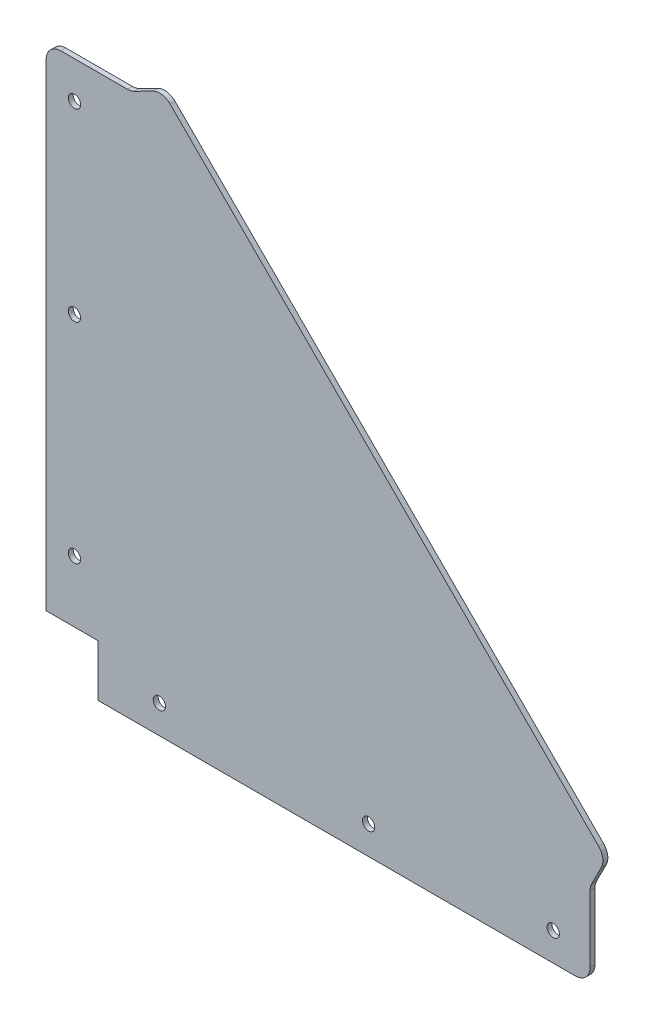
ISO-10303-21;
HEADER;
FILE_DESCRIPTION(('STEP AP214'),'2;1');
FILE_NAME('part.step','',(''),(''),'','','');
FILE_SCHEMA(('AUTOMOTIVE_DESIGN { 1 0 10303 214 1 1 1 1 }'));
ENDSEC;
DATA;
#1=APPLICATION_CONTEXT('core data for automotive mechanical design processes');
#2=APPLICATION_PROTOCOL_DEFINITION('international standard','automotive_design',2000,#1);
#3=PRODUCT_CONTEXT('',#1,'mechanical');
#4=PRODUCT('Part','Part','',(#3));
#5=PRODUCT_RELATED_PRODUCT_CATEGORY('part','',(#4));
#6=PRODUCT_DEFINITION_FORMATION('','',#4);
#7=PRODUCT_DEFINITION_CONTEXT('part definition',#1,'design');
#8=PRODUCT_DEFINITION('design','',#6,#7);
#9=PRODUCT_DEFINITION_SHAPE('','',#8);
#10=(LENGTH_UNIT() NAMED_UNIT(*) SI_UNIT(.MILLI.,.METRE.));
#11=(NAMED_UNIT(*) PLANE_ANGLE_UNIT() SI_UNIT($,.RADIAN.));
#12=(NAMED_UNIT(*) SI_UNIT($,.STERADIAN.) SOLID_ANGLE_UNIT());
#13=UNCERTAINTY_MEASURE_WITH_UNIT(LENGTH_MEASURE(1.E-05),#10,'distance_accuracy_value','');
#14=(GEOMETRIC_REPRESENTATION_CONTEXT(3) GLOBAL_UNCERTAINTY_ASSIGNED_CONTEXT((#13)) GLOBAL_UNIT_ASSIGNED_CONTEXT((#10,
#11,#12)) REPRESENTATION_CONTEXT('',''));
#15=CARTESIAN_POINT('',(0.,0.,0.));
#16=DIRECTION('',(0.,0.,1.));
#17=DIRECTION('',(1.,0.,0.));
#18=AXIS2_PLACEMENT_3D('',#15,#16,#17);
#19=CARTESIAN_POINT('',(21.,0.,2.));
#20=DIRECTION('',(-1.,0.,0.));
#21=DIRECTION('',(0.,-1.,0.));
#22=AXIS2_PLACEMENT_3D('',#19,#20,#21);
#23=PLANE('',#22);
#24=DIRECTION('',(0.,1.,0.));
#25=VECTOR('',#24,1.);
#26=CARTESIAN_POINT('',(21.,0.,0.));
#27=LINE('',#26,#25);
#28=CARTESIAN_POINT('',(21.,2.22044604925031E-13,0.));
#29=VERTEX_POINT('',#28);
#30=CARTESIAN_POINT('',(21.,21.0000000000002,0.));
#31=VERTEX_POINT('',#30);
#32=EDGE_CURVE('E159',#29,#31,#27,.T.);
#33=ORIENTED_EDGE('',*,*,#32,.F.);
#34=DIRECTION('',(0.,0.,-1.));
#35=VECTOR('',#34,1.);
#36=CARTESIAN_POINT('',(21.,2.22044604925031E-13,2.));
#37=LINE('',#36,#35);
#38=CARTESIAN_POINT('',(21.,2.22044604925031E-13,2.));
#39=VERTEX_POINT('',#38);
#40=EDGE_CURVE('E146',#39,#29,#37,.T.);
#41=ORIENTED_EDGE('',*,*,#40,.F.);
#42=DIRECTION('',(0.,1.,0.));
#43=VECTOR('',#42,1.);
#44=CARTESIAN_POINT('',(21.,0.,2.));
#45=LINE('',#44,#43);
#46=CARTESIAN_POINT('',(21.,21.0000000000002,2.));
#47=VERTEX_POINT('',#46);
#48=EDGE_CURVE('E153',#39,#47,#45,.T.);
#49=ORIENTED_EDGE('',*,*,#48,.T.);
#50=DIRECTION('',(0.,0.,-1.));
#51=VECTOR('',#50,1.);
#52=CARTESIAN_POINT('',(21.,21.0000000000002,2.));
#53=LINE('',#52,#51);
#54=EDGE_CURVE('E189',#47,#31,#53,.T.);
#55=ORIENTED_EDGE('',*,*,#54,.T.);
#56=EDGE_LOOP('',(#33,#41,#49,#55));
#57=FACE_BOUND('',#56,.T.);
#58=ADVANCED_FACE('F33',(#57),#23,.T.);
#59=CARTESIAN_POINT('',(0.,2.4535928844216E-13,2.));
#60=DIRECTION('',(0.,-1.,0.));
#61=DIRECTION('',(1.,0.,0.));
#62=AXIS2_PLACEMENT_3D('',#59,#60,#61);
#63=PLANE('',#62);
#64=DIRECTION('',(-1.,0.,0.));
#65=VECTOR('',#64,1.);
#66=CARTESIAN_POINT('',(0.,2.4535928844216E-13,0.));
#67=LINE('',#66,#65);
#68=CARTESIAN_POINT('',(215.,0.,0.));
#69=VERTEX_POINT('',#68);
#70=EDGE_CURVE('E209',#69,#29,#67,.T.);
#71=ORIENTED_EDGE('',*,*,#70,.F.);
#72=DIRECTION('',(0.,0.,-1.));
#73=VECTOR('',#72,1.);
#74=CARTESIAN_POINT('',(215.,0.,2.));
#75=LINE('',#74,#73);
#76=CARTESIAN_POINT('',(215.,0.,2.));
#77=VERTEX_POINT('',#76);
#78=EDGE_CURVE('E149',#69,#77,#75,.F.);
#79=ORIENTED_EDGE('',*,*,#78,.T.);
#80=DIRECTION('',(-1.,0.,0.));
#81=VECTOR('',#80,1.);
#82=CARTESIAN_POINT('',(0.,2.4535928844216E-13,2.));
#83=LINE('',#82,#81);
#84=EDGE_CURVE('E142',#77,#39,#83,.T.);
#85=ORIENTED_EDGE('',*,*,#84,.T.);
#86=ORIENTED_EDGE('',*,*,#40,.T.);
#87=EDGE_LOOP('',(#71,#79,#85,#86));
#88=FACE_BOUND('',#87,.T.);
#89=ADVANCED_FACE('F145',(#88),#63,.T.);
#90=CARTESIAN_POINT('',(221.,0.,2.));
#91=DIRECTION('',(1.,0.,0.));
#92=DIRECTION('',(0.,0.,-1.));
#93=AXIS2_PLACEMENT_3D('',#90,#91,#92);
#94=PLANE('',#93);
#95=DIRECTION('',(0.,-1.,0.));
#96=VECTOR('',#95,1.);
#97=CARTESIAN_POINT('',(221.,0.,0.));
#98=LINE('',#97,#96);
#99=CARTESIAN_POINT('',(221.,33.0595274455194,0.));
#100=VERTEX_POINT('',#99);
#101=CARTESIAN_POINT('',(221.,6.00000000000001,0.));
#102=VERTEX_POINT('',#101);
#103=EDGE_CURVE('E211',#100,#102,#98,.T.);
#104=ORIENTED_EDGE('',*,*,#103,.F.);
#105=DIRECTION('',(0.,0.,-1.));
#106=VECTOR('',#105,1.);
#107=CARTESIAN_POINT('',(221.,33.0595274455194,2.));
#108=LINE('',#107,#106);
#109=CARTESIAN_POINT('',(221.,33.0595274455194,2.));
#110=VERTEX_POINT('',#109);
#111=EDGE_CURVE('E252',#100,#110,#108,.F.);
#112=ORIENTED_EDGE('',*,*,#111,.T.);
#113=DIRECTION('',(0.,-1.,0.));
#114=VECTOR('',#113,1.);
#115=CARTESIAN_POINT('',(221.,0.,2.));
#116=LINE('',#115,#114);
#117=CARTESIAN_POINT('',(221.,6.00000000000001,2.));
#118=VERTEX_POINT('',#117);
#119=EDGE_CURVE('E152',#110,#118,#116,.T.);
#120=ORIENTED_EDGE('',*,*,#119,.T.);
#121=DIRECTION('',(0.,0.,-1.));
#122=VECTOR('',#121,1.);
#123=CARTESIAN_POINT('',(221.,6.00000000000001,2.));
#124=LINE('',#123,#122);
#125=EDGE_CURVE('E249',#118,#102,#124,.T.);
#126=ORIENTED_EDGE('',*,*,#125,.T.);
#127=EDGE_LOOP('',(#104,#112,#120,#126));
#128=FACE_BOUND('',#127,.T.);
#129=ADVANCED_FACE('F288',(#128),#94,.T.);
#130=CARTESIAN_POINT('',(161.494727225348,-82.2856734804783,2.));
#131=DIRECTION('',(0.891006524188361,-0.453990499739559,0.));
#132=DIRECTION('',(0.45399049973956,0.891006524188362,0.));
#133=AXIS2_PLACEMENT_3D('',#130,#131,#132);
#134=PLANE('',#133);
#135=DIRECTION('',(-0.45399049973956,-0.891006524188361,0.));
#136=VECTOR('',#135,1.);
#137=CARTESIAN_POINT('',(161.494727225348,-82.2856734804783,2.));
#138=LINE('',#137,#136);
#139=CARTESIAN_POINT('',(225.543411413391,43.4169469707534,2.));
#140=VERTEX_POINT('',#139);
#141=CARTESIAN_POINT('',(221.65396085487,35.7834704439568,2.));
#142=VERTEX_POINT('',#141);
#143=EDGE_CURVE('E175',#140,#142,#138,.T.);
#144=ORIENTED_EDGE('',*,*,#143,.T.);
#145=DIRECTION('',(0.,0.,-1.));
#146=VECTOR('',#145,1.);
#147=CARTESIAN_POINT('',(221.65396085487,35.7834704439568,0.));
#148=LINE('',#147,#146);
#149=CARTESIAN_POINT('',(221.65396085487,35.7834704439568,0.));
#150=VERTEX_POINT('',#149);
#151=EDGE_CURVE('E246',#142,#150,#148,.T.);
#152=ORIENTED_EDGE('',*,*,#151,.T.);
#153=DIRECTION('',(-0.45399049973956,-0.891006524188361,0.));
#154=VECTOR('',#153,1.);
#155=CARTESIAN_POINT('',(161.494727225348,-82.2856734804783,0.));
#156=LINE('',#155,#154);
#157=CARTESIAN_POINT('',(225.543411413391,43.4169469707534,0.));
#158=VERTEX_POINT('',#157);
#159=EDGE_CURVE('E214',#158,#150,#156,.T.);
#160=ORIENTED_EDGE('',*,*,#159,.F.);
#161=DIRECTION('',(0.,0.,-1.));
#162=VECTOR('',#161,1.);
#163=CARTESIAN_POINT('',(225.543411413391,43.4169469707535,2.));
#164=LINE('',#163,#162);
#165=EDGE_CURVE('E244',#158,#140,#164,.F.);
#166=ORIENTED_EDGE('',*,*,#165,.T.);
#167=EDGE_LOOP('',(#144,#152,#160,#166));
#168=FACE_BOUND('',#167,.T.);
#169=ADVANCED_FACE('F294',(#168),#134,.T.);
#170=CARTESIAN_POINT('',(137.411771805846,137.411771805845,2.));
#171=DIRECTION('',(0.707106781186549,0.707106781186546,0.));
#172=DIRECTION('',(-0.707106781186546,0.707106781186549,0.));
#173=AXIS2_PLACEMENT_3D('',#170,#171,#172);
#174=PLANE('',#173);
#175=DIRECTION('',(0.707106781186546,-0.707106781186549,0.));
#176=VECTOR('',#175,1.);
#177=CARTESIAN_POINT('',(137.411771805846,137.411771805845,2.));
#178=LINE('',#177,#176);
#179=CARTESIAN_POINT('',(50.3835306563098,224.440012955381,2.));
#180=VERTEX_POINT('',#179);
#181=CARTESIAN_POINT('',(224.44001295538,50.3835306563101,2.));
#182=VERTEX_POINT('',#181);
#183=EDGE_CURVE('E178',#180,#182,#178,.T.);
#184=ORIENTED_EDGE('',*,*,#183,.T.);
#185=DIRECTION('',(0.,0.,-1.));
#186=VECTOR('',#185,1.);
#187=CARTESIAN_POINT('',(224.44001295538,50.3835306563101,2.));
#188=LINE('',#187,#186);
#189=CARTESIAN_POINT('',(224.44001295538,50.3835306563101,0.));
#190=VERTEX_POINT('',#189);
#191=EDGE_CURVE('E271',#182,#190,#188,.T.);
#192=ORIENTED_EDGE('',*,*,#191,.T.);
#193=DIRECTION('',(0.707106781186546,-0.707106781186549,0.));
#194=VECTOR('',#193,1.);
#195=CARTESIAN_POINT('',(137.411771805846,137.411771805845,0.));
#196=LINE('',#195,#194);
#197=CARTESIAN_POINT('',(50.3835306563098,224.440012955381,0.));
#198=VERTEX_POINT('',#197);
#199=EDGE_CURVE('E217',#198,#190,#196,.T.);
#200=ORIENTED_EDGE('',*,*,#199,.F.);
#201=DIRECTION('',(0.,0.,-1.));
#202=VECTOR('',#201,1.);
#203=CARTESIAN_POINT('',(50.3835306563098,224.440012955381,2.));
#204=LINE('',#203,#202);
#205=EDGE_CURVE('E269',#198,#180,#204,.F.);
#206=ORIENTED_EDGE('',*,*,#205,.T.);
#207=EDGE_LOOP('',(#184,#192,#200,#206));
#208=FACE_BOUND('',#207,.T.);
#209=ADVANCED_FACE('F301',(#208),#174,.T.);
#210=CARTESIAN_POINT('',(-82.2856734804732,161.49472722536,2.));
#211=DIRECTION('',(-0.453990499739509,0.891006524188387,0.));
#212=DIRECTION('',(-0.891006524188387,-0.453990499739509,0.));
#213=AXIS2_PLACEMENT_3D('',#210,#211,#212);
#214=PLANE('',#213);
#215=DIRECTION('',(0.891006524188387,0.453990499739509,0.));
#216=VECTOR('',#215,1.);
#217=CARTESIAN_POINT('',(-82.2856734804732,161.49472722536,0.));
#218=LINE('',#217,#216);
#219=CARTESIAN_POINT('',(35.7834704439556,221.653960854871,0.));
#220=VERTEX_POINT('',#219);
#221=CARTESIAN_POINT('',(43.4169469707535,225.543411413392,0.));
#222=VERTEX_POINT('',#221);
#223=EDGE_CURVE('E220',#220,#222,#218,.T.);
#224=ORIENTED_EDGE('',*,*,#223,.F.);
#225=DIRECTION('',(0.,0.,-1.));
#226=VECTOR('',#225,1.);
#227=CARTESIAN_POINT('',(35.7834704439556,221.653960854871,2.));
#228=LINE('',#227,#226);
#229=CARTESIAN_POINT('',(35.7834704439556,221.653960854871,2.));
#230=VERTEX_POINT('',#229);
#231=EDGE_CURVE('E242',#220,#230,#228,.F.);
#232=ORIENTED_EDGE('',*,*,#231,.T.);
#233=DIRECTION('',(0.891006524188387,0.453990499739509,0.));
#234=VECTOR('',#233,1.);
#235=CARTESIAN_POINT('',(-82.2856734804732,161.49472722536,2.));
#236=LINE('',#235,#234);
#237=CARTESIAN_POINT('',(43.4169469707535,225.543411413392,2.));
#238=VERTEX_POINT('',#237);
#239=EDGE_CURVE('E180',#230,#238,#236,.T.);
#240=ORIENTED_EDGE('',*,*,#239,.T.);
#241=DIRECTION('',(0.,0.,-1.));
#242=VECTOR('',#241,1.);
#243=CARTESIAN_POINT('',(43.4169469707535,225.543411413392,2.));
#244=LINE('',#243,#242);
#245=EDGE_CURVE('E239',#238,#222,#244,.T.);
#246=ORIENTED_EDGE('',*,*,#245,.T.);
#247=EDGE_LOOP('',(#224,#232,#240,#246));
#248=FACE_BOUND('',#247,.T.);
#249=ADVANCED_FACE('F309',(#248),#214,.T.);
#250=CARTESIAN_POINT('',(-7.11186343310625E-12,221.,2.));
#251=DIRECTION('',(0.,1.,0.));
#252=DIRECTION('',(-1.,0.,0.));
#253=AXIS2_PLACEMENT_3D('',#250,#251,#252);
#254=PLANE('',#253);
#255=DIRECTION('',(1.,0.,0.));
#256=VECTOR('',#255,1.);
#257=CARTESIAN_POINT('',(-7.11186343310625E-12,221.,2.));
#258=LINE('',#257,#256);
#259=CARTESIAN_POINT('',(5.9999999999998,221.,2.));
#260=VERTEX_POINT('',#259);
#261=CARTESIAN_POINT('',(33.0595274455187,221.000000000001,2.));
#262=VERTEX_POINT('',#261);
#263=EDGE_CURVE('E183',#260,#262,#258,.T.);
#264=ORIENTED_EDGE('',*,*,#263,.T.);
#265=DIRECTION('',(0.,0.,-1.));
#266=VECTOR('',#265,1.);
#267=CARTESIAN_POINT('',(33.0595274455187,221.000000000001,0.));
#268=LINE('',#267,#266);
#269=CARTESIAN_POINT('',(33.0595274455187,221.000000000001,0.));
#270=VERTEX_POINT('',#269);
#271=EDGE_CURVE('E236',#262,#270,#268,.T.);
#272=ORIENTED_EDGE('',*,*,#271,.T.);
#273=DIRECTION('',(1.,0.,0.));
#274=VECTOR('',#273,1.);
#275=CARTESIAN_POINT('',(-7.11186343310625E-12,221.,0.));
#276=LINE('',#275,#274);
#277=CARTESIAN_POINT('',(5.9999999999998,221.,0.));
#278=VERTEX_POINT('',#277);
#279=EDGE_CURVE('E223',#278,#270,#276,.T.);
#280=ORIENTED_EDGE('',*,*,#279,.F.);
#281=DIRECTION('',(0.,0.,-1.));
#282=VECTOR('',#281,1.);
#283=CARTESIAN_POINT('',(5.9999999999998,221.,2.));
#284=LINE('',#283,#282);
#285=EDGE_CURVE('E160',#278,#260,#284,.F.);
#286=ORIENTED_EDGE('',*,*,#285,.T.);
#287=EDGE_LOOP('',(#264,#272,#280,#286));
#288=FACE_BOUND('',#287,.T.);
#289=ADVANCED_FACE('F318',(#288),#254,.T.);
#290=CARTESIAN_POINT('',(0.,0.,2.));
#291=DIRECTION('',(-1.,0.,0.));
#292=DIRECTION('',(0.,0.,1.));
#293=AXIS2_PLACEMENT_3D('',#290,#291,#292);
#294=PLANE('',#293);
#295=DIRECTION('',(0.,1.,0.));
#296=VECTOR('',#295,1.);
#297=CARTESIAN_POINT('',(0.,0.,2.));
#298=LINE('',#297,#296);
#299=CARTESIAN_POINT('',(0.,21.,2.));
#300=VERTEX_POINT('',#299);
#301=CARTESIAN_POINT('',(0.,215.,2.));
#302=VERTEX_POINT('',#301);
#303=EDGE_CURVE('E186',#300,#302,#298,.T.);
#304=ORIENTED_EDGE('',*,*,#303,.T.);
#305=DIRECTION('',(0.,0.,-1.));
#306=VECTOR('',#305,1.);
#307=CARTESIAN_POINT('',(0.,215.,2.));
#308=LINE('',#307,#306);
#309=CARTESIAN_POINT('',(0.,215.,0.));
#310=VERTEX_POINT('',#309);
#311=EDGE_CURVE('E274',#302,#310,#308,.T.);
#312=ORIENTED_EDGE('',*,*,#311,.T.);
#313=DIRECTION('',(0.,1.,0.));
#314=VECTOR('',#313,1.);
#315=CARTESIAN_POINT('',(0.,0.,0.));
#316=LINE('',#315,#314);
#317=CARTESIAN_POINT('',(0.,21.,0.));
#318=VERTEX_POINT('',#317);
#319=EDGE_CURVE('E226',#318,#310,#316,.T.);
#320=ORIENTED_EDGE('',*,*,#319,.F.);
#321=DIRECTION('',(0.,0.,-1.));
#322=VECTOR('',#321,1.);
#323=CARTESIAN_POINT('',(0.,21.,2.));
#324=LINE('',#323,#322);
#325=EDGE_CURVE('E161',#300,#318,#324,.T.);
#326=ORIENTED_EDGE('',*,*,#325,.F.);
#327=EDGE_LOOP('',(#304,#312,#320,#326));
#328=FACE_BOUND('',#327,.T.);
#329=ADVANCED_FACE('F324',(#328),#294,.T.);
#330=CARTESIAN_POINT('',(206.,11.5,2.));
#331=DIRECTION('',(0.,0.,-1.));
#332=DIRECTION('',(-1.,0.,0.));
#333=AXIS2_PLACEMENT_3D('',#330,#331,#332);
#334=CYLINDRICAL_SURFACE('',#333,2.49999999999995);
#335=CARTESIAN_POINT('',(206.,11.5,2.));
#336=DIRECTION('',(0.,0.,1.));
#337=DIRECTION('',(1.,0.,0.));
#338=AXIS2_PLACEMENT_3D('',#335,#336,#337);
#339=CIRCLE('',#338,2.49999999999995);
#340=CARTESIAN_POINT('',(208.5,11.5,2.));
#341=VERTEX_POINT('',#340);
#342=EDGE_CURVE('E166',#341,#341,#339,.T.);
#343=ORIENTED_EDGE('',*,*,#342,.T.);
#344=EDGE_LOOP('',(#343));
#345=FACE_BOUND('',#344,.T.);
#346=CARTESIAN_POINT('',(206.,11.5,0.));
#347=DIRECTION('',(0.,0.,1.));
#348=DIRECTION('',(1.,0.,0.));
#349=AXIS2_PLACEMENT_3D('',#346,#347,#348);
#350=CIRCLE('',#349,2.49999999999995);
#351=CARTESIAN_POINT('',(208.5,11.5,0.));
#352=VERTEX_POINT('',#351);
#353=EDGE_CURVE('E205',#352,#352,#350,.T.);
#354=ORIENTED_EDGE('',*,*,#353,.F.);
#355=EDGE_LOOP('',(#354));
#356=FACE_BOUND('',#355,.T.);
#357=ADVANCED_FACE('F346',(#345,#356),#334,.F.);
#358=CARTESIAN_POINT('',(131.,11.5000000000002,2.));
#359=DIRECTION('',(0.,0.,-1.));
#360=DIRECTION('',(-1.,0.,0.));
#361=AXIS2_PLACEMENT_3D('',#358,#359,#360);
#362=CYLINDRICAL_SURFACE('',#361,2.5);
#363=CARTESIAN_POINT('',(131.,11.5000000000002,2.));
#364=DIRECTION('',(0.,0.,1.));
#365=DIRECTION('',(1.,0.,0.));
#366=AXIS2_PLACEMENT_3D('',#363,#364,#365);
#367=CIRCLE('',#366,2.5);
#368=CARTESIAN_POINT('',(133.5,11.5000000000002,2.));
#369=VERTEX_POINT('',#368);
#370=EDGE_CURVE('E169',#369,#369,#367,.T.);
#371=ORIENTED_EDGE('',*,*,#370,.T.);
#372=EDGE_LOOP('',(#371));
#373=FACE_BOUND('',#372,.T.);
#374=CARTESIAN_POINT('',(131.,11.5000000000002,0.));
#375=DIRECTION('',(0.,0.,1.));
#376=DIRECTION('',(1.,0.,0.));
#377=AXIS2_PLACEMENT_3D('',#374,#375,#376);
#378=CIRCLE('',#377,2.5);
#379=CARTESIAN_POINT('',(133.5,11.5000000000002,0.));
#380=VERTEX_POINT('',#379);
#381=EDGE_CURVE('E202',#380,#380,#378,.T.);
#382=ORIENTED_EDGE('',*,*,#381,.F.);
#383=EDGE_LOOP('',(#382));
#384=FACE_BOUND('',#383,.T.);
#385=ADVANCED_FACE('F349',(#373,#384),#362,.F.);
#386=CARTESIAN_POINT('',(46.,11.5,2.));
#387=DIRECTION('',(0.,0.,-1.));
#388=DIRECTION('',(-1.,0.,0.));
#389=AXIS2_PLACEMENT_3D('',#386,#387,#388);
#390=CYLINDRICAL_SURFACE('',#389,2.5);
#391=CARTESIAN_POINT('',(46.,11.5,2.));
#392=DIRECTION('',(0.,0.,1.));
#393=DIRECTION('',(1.,0.,0.));
#394=AXIS2_PLACEMENT_3D('',#391,#392,#393);
#395=CIRCLE('',#394,2.5);
#396=CARTESIAN_POINT('',(48.5,11.5,2.));
#397=VERTEX_POINT('',#396);
#398=EDGE_CURVE('E563',#397,#397,#395,.T.);
#399=ORIENTED_EDGE('',*,*,#398,.T.);
#400=EDGE_LOOP('',(#399));
#401=FACE_BOUND('',#400,.T.);
#402=CARTESIAN_POINT('',(46.,11.5,0.));
#403=DIRECTION('',(0.,0.,1.));
#404=DIRECTION('',(1.,0.,0.));
#405=AXIS2_PLACEMENT_3D('',#402,#403,#404);
#406=CIRCLE('',#405,2.5);
#407=CARTESIAN_POINT('',(48.5,11.5,0.));
#408=VERTEX_POINT('',#407);
#409=EDGE_CURVE('E199',#408,#408,#406,.T.);
#410=ORIENTED_EDGE('',*,*,#409,.F.);
#411=EDGE_LOOP('',(#410));
#412=FACE_BOUND('',#411,.T.);
#413=ADVANCED_FACE('F353',(#401,#412),#390,.F.);
#414=CARTESIAN_POINT('',(11.5000000000004,206.,2.));
#415=DIRECTION('',(0.,0.,-1.));
#416=DIRECTION('',(-1.,0.,0.));
#417=AXIS2_PLACEMENT_3D('',#414,#415,#416);
#418=CYLINDRICAL_SURFACE('',#417,2.49999999999953);
#419=CARTESIAN_POINT('',(11.5000000000004,206.,2.));
#420=DIRECTION('',(0.,0.,1.));
#421=DIRECTION('',(1.,0.,0.));
#422=AXIS2_PLACEMENT_3D('',#419,#420,#421);
#423=CIRCLE('',#422,2.49999999999953);
#424=CARTESIAN_POINT('',(14.,206.,2.));
#425=VERTEX_POINT('',#424);
#426=EDGE_CURVE('E559',#425,#425,#423,.T.);
#427=ORIENTED_EDGE('',*,*,#426,.T.);
#428=EDGE_LOOP('',(#427));
#429=FACE_BOUND('',#428,.T.);
#430=CARTESIAN_POINT('',(11.5000000000004,206.,0.));
#431=DIRECTION('',(0.,0.,1.));
#432=DIRECTION('',(1.,0.,0.));
#433=AXIS2_PLACEMENT_3D('',#430,#431,#432);
#434=CIRCLE('',#433,2.49999999999953);
#435=CARTESIAN_POINT('',(14.,206.,0.));
#436=VERTEX_POINT('',#435);
#437=EDGE_CURVE('E196',#436,#436,#434,.T.);
#438=ORIENTED_EDGE('',*,*,#437,.F.);
#439=EDGE_LOOP('',(#438));
#440=FACE_BOUND('',#439,.T.);
#441=ADVANCED_FACE('F357',(#429,#440),#418,.F.);
#442=CARTESIAN_POINT('',(11.5,131.,2.));
#443=DIRECTION('',(0.,0.,-1.));
#444=DIRECTION('',(-1.,0.,0.));
#445=AXIS2_PLACEMENT_3D('',#442,#443,#444);
#446=CYLINDRICAL_SURFACE('',#445,2.5);
#447=CARTESIAN_POINT('',(11.5,131.,2.));
#448=DIRECTION('',(0.,0.,1.));
#449=DIRECTION('',(1.,0.,0.));
#450=AXIS2_PLACEMENT_3D('',#447,#448,#449);
#451=CIRCLE('',#450,2.5);
#452=CARTESIAN_POINT('',(14.,131.,2.));
#453=VERTEX_POINT('',#452);
#454=EDGE_CURVE('E555',#453,#453,#451,.T.);
#455=ORIENTED_EDGE('',*,*,#454,.T.);
#456=EDGE_LOOP('',(#455));
#457=FACE_BOUND('',#456,.T.);
#458=CARTESIAN_POINT('',(11.5,131.,0.));
#459=DIRECTION('',(0.,0.,1.));
#460=DIRECTION('',(1.,0.,0.));
#461=AXIS2_PLACEMENT_3D('',#458,#459,#460);
#462=CIRCLE('',#461,2.5);
#463=CARTESIAN_POINT('',(14.,131.,0.));
#464=VERTEX_POINT('',#463);
#465=EDGE_CURVE('E193',#464,#464,#462,.T.);
#466=ORIENTED_EDGE('',*,*,#465,.F.);
#467=EDGE_LOOP('',(#466));
#468=FACE_BOUND('',#467,.T.);
#469=ADVANCED_FACE('F361',(#457,#468),#446,.F.);
#470=CARTESIAN_POINT('',(11.5,46.,2.));
#471=DIRECTION('',(0.,0.,-1.));
#472=DIRECTION('',(-1.,0.,0.));
#473=AXIS2_PLACEMENT_3D('',#470,#471,#472);
#474=CYLINDRICAL_SURFACE('',#473,2.5);
#475=CARTESIAN_POINT('',(11.5,46.,2.));
#476=DIRECTION('',(0.,0.,1.));
#477=DIRECTION('',(1.,0.,0.));
#478=AXIS2_PLACEMENT_3D('',#475,#476,#477);
#479=CIRCLE('',#478,2.5);
#480=CARTESIAN_POINT('',(14.,46.,2.));
#481=VERTEX_POINT('',#480);
#482=EDGE_CURVE('E232',#481,#481,#479,.T.);
#483=ORIENTED_EDGE('',*,*,#482,.T.);
#484=EDGE_LOOP('',(#483));
#485=FACE_BOUND('',#484,.T.);
#486=CARTESIAN_POINT('',(11.5,46.,0.));
#487=DIRECTION('',(0.,0.,1.));
#488=DIRECTION('',(1.,0.,0.));
#489=AXIS2_PLACEMENT_3D('',#486,#487,#488);
#490=CIRCLE('',#489,2.5);
#491=CARTESIAN_POINT('',(14.,46.,0.));
#492=VERTEX_POINT('',#491);
#493=EDGE_CURVE('E190',#492,#492,#490,.T.);
#494=ORIENTED_EDGE('',*,*,#493,.F.);
#495=EDGE_LOOP('',(#494));
#496=FACE_BOUND('',#495,.T.);
#497=ADVANCED_FACE('F365',(#485,#496),#474,.F.);
#498=CARTESIAN_POINT('',(-2.18575157973078E-13,21.,2.));
#499=DIRECTION('',(0.,-1.,0.));
#500=DIRECTION('',(1.,0.,0.));
#501=AXIS2_PLACEMENT_3D('',#498,#499,#500);
#502=PLANE('',#501);
#503=DIRECTION('',(-1.,0.,0.));
#504=VECTOR('',#503,1.);
#505=CARTESIAN_POINT('',(-2.18575157973078E-13,21.,0.));
#506=LINE('',#505,#504);
#507=EDGE_CURVE('E229',#31,#318,#506,.T.);
#508=ORIENTED_EDGE('',*,*,#507,.F.);
#509=ORIENTED_EDGE('',*,*,#54,.F.);
#510=DIRECTION('',(-1.,0.,0.));
#511=VECTOR('',#510,1.);
#512=CARTESIAN_POINT('',(-2.18575157973078E-13,21.,2.));
#513=LINE('',#512,#511);
#514=EDGE_CURVE('E165',#47,#300,#513,.T.);
#515=ORIENTED_EDGE('',*,*,#514,.T.);
#516=ORIENTED_EDGE('',*,*,#325,.T.);
#517=EDGE_LOOP('',(#508,#509,#515,#516));
#518=FACE_BOUND('',#517,.T.);
#519=ADVANCED_FACE('F327',(#518),#502,.T.);
#520=CARTESIAN_POINT('',(0.,0.,2.));
#521=DIRECTION('',(0.,0.,1.));
#522=DIRECTION('',(1.,0.,0.));
#523=AXIS2_PLACEMENT_3D('',#520,#521,#522);
#524=PLANE('',#523);
#525=ORIENTED_EDGE('',*,*,#482,.F.);
#526=EDGE_LOOP('',(#525));
#527=FACE_BOUND('',#526,.T.);
#528=ORIENTED_EDGE('',*,*,#454,.F.);
#529=EDGE_LOOP('',(#528));
#530=FACE_BOUND('',#529,.T.);
#531=ORIENTED_EDGE('',*,*,#426,.F.);
#532=EDGE_LOOP('',(#531));
#533=FACE_BOUND('',#532,.T.);
#534=ORIENTED_EDGE('',*,*,#398,.F.);
#535=EDGE_LOOP('',(#534));
#536=FACE_BOUND('',#535,.T.);
#537=ORIENTED_EDGE('',*,*,#370,.F.);
#538=EDGE_LOOP('',(#537));
#539=FACE_BOUND('',#538,.T.);
#540=ORIENTED_EDGE('',*,*,#342,.F.);
#541=EDGE_LOOP('',(#540));
#542=FACE_BOUND('',#541,.T.);
#543=ORIENTED_EDGE('',*,*,#84,.F.);
#544=CARTESIAN_POINT('',(215.,6.00000000000001,2.));
#545=DIRECTION('',(0.,0.,1.));
#546=DIRECTION('',(1.,0.,0.));
#547=AXIS2_PLACEMENT_3D('',#544,#545,#546);
#548=CIRCLE('',#547,6.);
#549=EDGE_CURVE('E267',#77,#118,#548,.T.);
#550=ORIENTED_EDGE('',*,*,#549,.T.);
#551=ORIENTED_EDGE('',*,*,#119,.F.);
#552=CARTESIAN_POINT('',(227.,33.0595274455194,2.));
#553=DIRECTION('',(0.,0.,1.));
#554=DIRECTION('',(1.,0.,0.));
#555=AXIS2_PLACEMENT_3D('',#552,#553,#554);
#556=CIRCLE('',#555,6.);
#557=EDGE_CURVE('E11',#110,#142,#556,.F.);
#558=ORIENTED_EDGE('',*,*,#557,.T.);
#559=ORIENTED_EDGE('',*,*,#143,.F.);
#560=CARTESIAN_POINT('',(220.197372268261,46.1408899691908,2.));
#561=DIRECTION('',(0.,0.,1.));
#562=DIRECTION('',(1.,0.,0.));
#563=AXIS2_PLACEMENT_3D('',#560,#561,#562);
#564=CIRCLE('',#563,6.);
#565=EDGE_CURVE('E55',#140,#182,#564,.T.);
#566=ORIENTED_EDGE('',*,*,#565,.T.);
#567=ORIENTED_EDGE('',*,*,#183,.F.);
#568=CARTESIAN_POINT('',(46.1408899691905,220.197372268262,2.));
#569=DIRECTION('',(0.,0.,1.));
#570=DIRECTION('',(1.,0.,0.));
#571=AXIS2_PLACEMENT_3D('',#568,#569,#570);
#572=CIRCLE('',#571,6.);
#573=EDGE_CURVE('E264',#180,#238,#572,.T.);
#574=ORIENTED_EDGE('',*,*,#573,.T.);
#575=ORIENTED_EDGE('',*,*,#239,.F.);
#576=CARTESIAN_POINT('',(33.0595274455185,227.000000000001,2.));
#577=DIRECTION('',(0.,0.,1.));
#578=DIRECTION('',(1.,0.,0.));
#579=AXIS2_PLACEMENT_3D('',#576,#577,#578);
#580=CIRCLE('',#579,6.);
#581=EDGE_CURVE('E279',#230,#262,#580,.F.);
#582=ORIENTED_EDGE('',*,*,#581,.T.);
#583=ORIENTED_EDGE('',*,*,#263,.F.);
#584=CARTESIAN_POINT('',(6.,215.,2.));
#585=DIRECTION('',(0.,0.,1.));
#586=DIRECTION('',(1.,0.,0.));
#587=AXIS2_PLACEMENT_3D('',#584,#585,#586);
#588=CIRCLE('',#587,6.);
#589=EDGE_CURVE('E48',#260,#302,#588,.T.);
#590=ORIENTED_EDGE('',*,*,#589,.T.);
#591=ORIENTED_EDGE('',*,*,#303,.F.);
#592=ORIENTED_EDGE('',*,*,#514,.F.);
#593=ORIENTED_EDGE('',*,*,#48,.F.);
#594=EDGE_LOOP('',(#543,#550,#551,#558,#559,#566,#567,#574,#575,#582,#583,#590,#591,#592,#593));
#595=FACE_BOUND('',#594,.T.);
#596=ADVANCED_FACE('F163',(#527,#530,#533,#536,#539,#542,#595),#524,.T.);
#597=CARTESIAN_POINT('',(0.,0.,0.));
#598=DIRECTION('',(0.,0.,1.));
#599=DIRECTION('',(1.,0.,0.));
#600=AXIS2_PLACEMENT_3D('',#597,#598,#599);
#601=PLANE('',#600);
#602=ORIENTED_EDGE('',*,*,#493,.T.);
#603=EDGE_LOOP('',(#602));
#604=FACE_BOUND('',#603,.T.);
#605=ORIENTED_EDGE('',*,*,#465,.T.);
#606=EDGE_LOOP('',(#605));
#607=FACE_BOUND('',#606,.T.);
#608=ORIENTED_EDGE('',*,*,#437,.T.);
#609=EDGE_LOOP('',(#608));
#610=FACE_BOUND('',#609,.T.);
#611=ORIENTED_EDGE('',*,*,#409,.T.);
#612=EDGE_LOOP('',(#611));
#613=FACE_BOUND('',#612,.T.);
#614=ORIENTED_EDGE('',*,*,#381,.T.);
#615=EDGE_LOOP('',(#614));
#616=FACE_BOUND('',#615,.T.);
#617=ORIENTED_EDGE('',*,*,#353,.T.);
#618=EDGE_LOOP('',(#617));
#619=FACE_BOUND('',#618,.T.);
#620=ORIENTED_EDGE('',*,*,#103,.T.);
#621=CARTESIAN_POINT('',(215.,6.00000000000001,0.));
#622=DIRECTION('',(0.,0.,1.));
#623=DIRECTION('',(1.,0.,0.));
#624=AXIS2_PLACEMENT_3D('',#621,#622,#623);
#625=CIRCLE('',#624,6.);
#626=EDGE_CURVE('E260',#102,#69,#625,.F.);
#627=ORIENTED_EDGE('',*,*,#626,.T.);
#628=ORIENTED_EDGE('',*,*,#70,.T.);
#629=ORIENTED_EDGE('',*,*,#32,.T.);
#630=ORIENTED_EDGE('',*,*,#507,.T.);
#631=ORIENTED_EDGE('',*,*,#319,.T.);
#632=CARTESIAN_POINT('',(6.,215.,0.));
#633=DIRECTION('',(0.,0.,1.));
#634=DIRECTION('',(1.,0.,0.));
#635=AXIS2_PLACEMENT_3D('',#632,#633,#634);
#636=CIRCLE('',#635,6.);
#637=EDGE_CURVE('E254',#310,#278,#636,.F.);
#638=ORIENTED_EDGE('',*,*,#637,.T.);
#639=ORIENTED_EDGE('',*,*,#279,.T.);
#640=CARTESIAN_POINT('',(33.0595274455185,227.000000000001,0.));
#641=DIRECTION('',(0.,0.,1.));
#642=DIRECTION('',(1.,0.,0.));
#643=AXIS2_PLACEMENT_3D('',#640,#641,#642);
#644=CIRCLE('',#643,6.);
#645=EDGE_CURVE('E277',#270,#220,#644,.T.);
#646=ORIENTED_EDGE('',*,*,#645,.T.);
#647=ORIENTED_EDGE('',*,*,#223,.T.);
#648=CARTESIAN_POINT('',(46.1408899691905,220.197372268262,0.));
#649=DIRECTION('',(0.,0.,1.));
#650=DIRECTION('',(1.,0.,0.));
#651=AXIS2_PLACEMENT_3D('',#648,#649,#650);
#652=CIRCLE('',#651,6.);
#653=EDGE_CURVE('E256',#222,#198,#652,.F.);
#654=ORIENTED_EDGE('',*,*,#653,.T.);
#655=ORIENTED_EDGE('',*,*,#199,.T.);
#656=CARTESIAN_POINT('',(220.197372268261,46.1408899691908,0.));
#657=DIRECTION('',(0.,0.,1.));
#658=DIRECTION('',(1.,0.,0.));
#659=AXIS2_PLACEMENT_3D('',#656,#657,#658);
#660=CIRCLE('',#659,6.);
#661=EDGE_CURVE('E258',#190,#158,#660,.F.);
#662=ORIENTED_EDGE('',*,*,#661,.T.);
#663=ORIENTED_EDGE('',*,*,#159,.T.);
#664=CARTESIAN_POINT('',(227.,33.0595274455194,0.));
#665=DIRECTION('',(0.,0.,1.));
#666=DIRECTION('',(1.,0.,0.));
#667=AXIS2_PLACEMENT_3D('',#664,#665,#666);
#668=CIRCLE('',#667,6.);
#669=EDGE_CURVE('E41',#150,#100,#668,.T.);
#670=ORIENTED_EDGE('',*,*,#669,.T.);
#671=EDGE_LOOP('',(#620,#627,#628,#629,#630,#631,#638,#639,#646,#647,#654,#655,#662,#663,#670));
#672=FACE_BOUND('',#671,.T.);
#673=ADVANCED_FACE('F282',(#604,#607,#610,#613,#616,#619,#672),#601,.F.);
#674=CARTESIAN_POINT('',(33.0595274455185,227.000000000001,2.));
#675=DIRECTION('',(0.,0.,1.));
#676=DIRECTION('',(1.,0.,0.));
#677=AXIS2_PLACEMENT_3D('',#674,#675,#676);
#678=CYLINDRICAL_SURFACE('',#677,6.);
#679=ORIENTED_EDGE('',*,*,#581,.F.);
#680=ORIENTED_EDGE('',*,*,#231,.F.);
#681=ORIENTED_EDGE('',*,*,#645,.F.);
#682=ORIENTED_EDGE('',*,*,#271,.F.);
#683=EDGE_LOOP('',(#679,#680,#681,#682));
#684=FACE_BOUND('',#683,.T.);
#685=ADVANCED_FACE('F315',(#684),#678,.F.);
#686=CARTESIAN_POINT('',(227.,33.0595274455194,2.));
#687=DIRECTION('',(0.,0.,1.));
#688=DIRECTION('',(1.,0.,0.));
#689=AXIS2_PLACEMENT_3D('',#686,#687,#688);
#690=CYLINDRICAL_SURFACE('',#689,6.);
#691=ORIENTED_EDGE('',*,*,#557,.F.);
#692=ORIENTED_EDGE('',*,*,#111,.F.);
#693=ORIENTED_EDGE('',*,*,#669,.F.);
#694=ORIENTED_EDGE('',*,*,#151,.F.);
#695=EDGE_LOOP('',(#691,#692,#693,#694));
#696=FACE_BOUND('',#695,.T.);
#697=ADVANCED_FACE('F292',(#696),#690,.F.);
#698=CARTESIAN_POINT('',(215.,6.00000000000001,2.));
#699=DIRECTION('',(0.,0.,-1.));
#700=DIRECTION('',(-1.,0.,0.));
#701=AXIS2_PLACEMENT_3D('',#698,#699,#700);
#702=CYLINDRICAL_SURFACE('',#701,6.);
#703=ORIENTED_EDGE('',*,*,#549,.F.);
#704=ORIENTED_EDGE('',*,*,#78,.F.);
#705=ORIENTED_EDGE('',*,*,#626,.F.);
#706=ORIENTED_EDGE('',*,*,#125,.F.);
#707=EDGE_LOOP('',(#703,#704,#705,#706));
#708=FACE_BOUND('',#707,.T.);
#709=ADVANCED_FACE('F329',(#708),#702,.T.);
#710=CARTESIAN_POINT('',(220.197372268261,46.1408899691908,2.));
#711=DIRECTION('',(0.,0.,-1.));
#712=DIRECTION('',(-1.,0.,0.));
#713=AXIS2_PLACEMENT_3D('',#710,#711,#712);
#714=CYLINDRICAL_SURFACE('',#713,6.);
#715=ORIENTED_EDGE('',*,*,#565,.F.);
#716=ORIENTED_EDGE('',*,*,#165,.F.);
#717=ORIENTED_EDGE('',*,*,#661,.F.);
#718=ORIENTED_EDGE('',*,*,#191,.F.);
#719=EDGE_LOOP('',(#715,#716,#717,#718));
#720=FACE_BOUND('',#719,.T.);
#721=ADVANCED_FACE('F297',(#720),#714,.T.);
#722=CARTESIAN_POINT('',(46.1408899691905,220.197372268262,2.));
#723=DIRECTION('',(0.,0.,-1.));
#724=DIRECTION('',(-1.,0.,0.));
#725=AXIS2_PLACEMENT_3D('',#722,#723,#724);
#726=CYLINDRICAL_SURFACE('',#725,6.);
#727=ORIENTED_EDGE('',*,*,#573,.F.);
#728=ORIENTED_EDGE('',*,*,#205,.F.);
#729=ORIENTED_EDGE('',*,*,#653,.F.);
#730=ORIENTED_EDGE('',*,*,#245,.F.);
#731=EDGE_LOOP('',(#727,#728,#729,#730));
#732=FACE_BOUND('',#731,.T.);
#733=ADVANCED_FACE('F307',(#732),#726,.T.);
#734=CARTESIAN_POINT('',(6.,215.,2.));
#735=DIRECTION('',(0.,0.,-1.));
#736=DIRECTION('',(-1.,0.,0.));
#737=AXIS2_PLACEMENT_3D('',#734,#735,#736);
#738=CYLINDRICAL_SURFACE('',#737,6.);
#739=ORIENTED_EDGE('',*,*,#589,.F.);
#740=ORIENTED_EDGE('',*,*,#285,.F.);
#741=ORIENTED_EDGE('',*,*,#637,.F.);
#742=ORIENTED_EDGE('',*,*,#311,.F.);
#743=EDGE_LOOP('',(#739,#740,#741,#742));
#744=FACE_BOUND('',#743,.T.);
#745=ADVANCED_FACE('F35',(#744),#738,.T.);
#746=CLOSED_SHELL('',(#58,#89,#129,#169,#209,#249,#289,#329,#357,#385,#413,#441,#469,#497,#519,
#596,#673,#685,#697,#709,#721,#733,#745));
#747=MANIFOLD_SOLID_BREP('B2',#746);
#748=ADVANCED_BREP_SHAPE_REPRESENTATION('',(#18,#747),#14);
#749=SHAPE_DEFINITION_REPRESENTATION(#9,#748);
ENDSEC;
END-ISO-10303-21;
